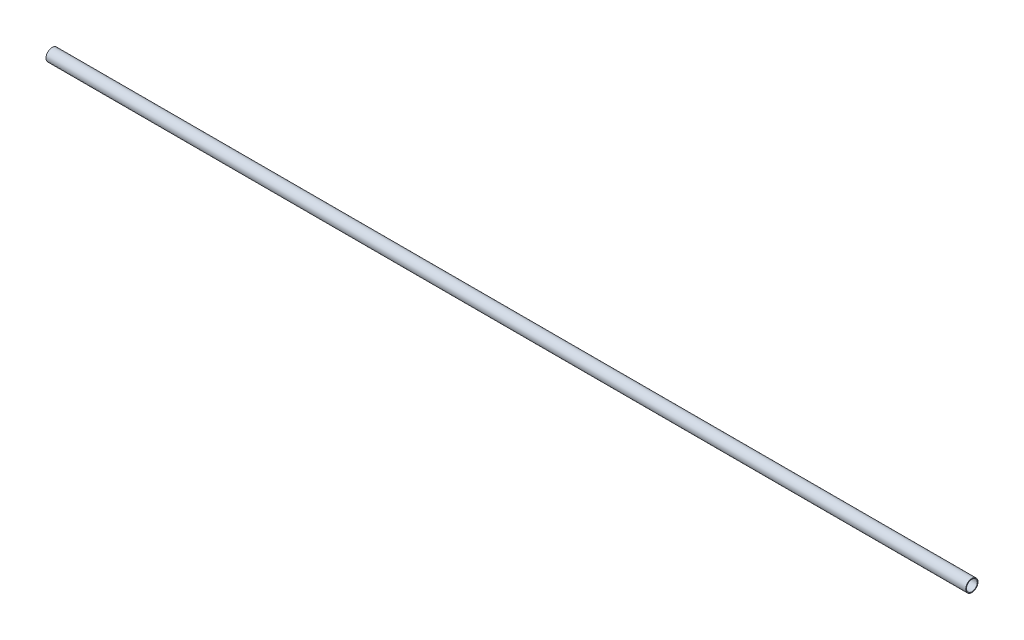
ISO-10303-21;
HEADER;
FILE_DESCRIPTION(('STEP AP214'),'2;1');
FILE_NAME('part.step','',(''),(''),'','','');
FILE_SCHEMA(('AUTOMOTIVE_DESIGN { 1 0 10303 214 1 1 1 1 }'));
ENDSEC;
DATA;
#1=APPLICATION_CONTEXT('core data for automotive mechanical design processes');
#2=APPLICATION_PROTOCOL_DEFINITION('international standard','automotive_design',2000,#1);
#3=PRODUCT_CONTEXT('',#1,'mechanical');
#4=PRODUCT('Part','Part','',(#3));
#5=PRODUCT_RELATED_PRODUCT_CATEGORY('part','',(#4));
#6=PRODUCT_DEFINITION_FORMATION('','',#4);
#7=PRODUCT_DEFINITION_CONTEXT('part definition',#1,'design');
#8=PRODUCT_DEFINITION('design','',#6,#7);
#9=PRODUCT_DEFINITION_SHAPE('','',#8);
#10=(LENGTH_UNIT() NAMED_UNIT(*) SI_UNIT(.MILLI.,.METRE.));
#11=(NAMED_UNIT(*) PLANE_ANGLE_UNIT() SI_UNIT($,.RADIAN.));
#12=(NAMED_UNIT(*) SI_UNIT($,.STERADIAN.) SOLID_ANGLE_UNIT());
#13=UNCERTAINTY_MEASURE_WITH_UNIT(LENGTH_MEASURE(1.E-05),#10,'distance_accuracy_value','');
#14=(GEOMETRIC_REPRESENTATION_CONTEXT(3) GLOBAL_UNCERTAINTY_ASSIGNED_CONTEXT((#13)) GLOBAL_UNIT_ASSIGNED_CONTEXT((#10,
#11,#12)) REPRESENTATION_CONTEXT('',''));
#15=CARTESIAN_POINT('',(0.,0.,0.));
#16=DIRECTION('',(0.,0.,1.));
#17=DIRECTION('',(1.,0.,0.));
#18=AXIS2_PLACEMENT_3D('',#15,#16,#17);
#19=CARTESIAN_POINT('',(1872.,0.,0.));
#20=DIRECTION('',(1.,0.,0.));
#21=DIRECTION('',(0.,0.,-1.));
#22=AXIS2_PLACEMENT_3D('',#19,#20,#21);
#23=PLANE('',#22);
#24=CARTESIAN_POINT('',(1872.,0.,0.));
#25=DIRECTION('',(1.,0.,0.));
#26=DIRECTION('',(0.,0.,-1.));
#27=AXIS2_PLACEMENT_3D('',#24,#25,#26);
#28=CIRCLE('',#27,12.5);
#29=CARTESIAN_POINT('',(1872.,0.,-12.5));
#30=VERTEX_POINT('',#29);
#31=EDGE_CURVE('E10',#30,#30,#28,.T.);
#32=ORIENTED_EDGE('',*,*,#31,.T.);
#33=EDGE_LOOP('',(#32));
#34=FACE_BOUND('',#33,.T.);
#35=CARTESIAN_POINT('',(1872.,0.,0.));
#36=DIRECTION('',(1.,0.,0.));
#37=DIRECTION('',(0.,0.,-1.));
#38=AXIS2_PLACEMENT_3D('',#35,#36,#37);
#39=CIRCLE('',#38,11.);
#40=CARTESIAN_POINT('',(1872.,0.,-11.));
#41=VERTEX_POINT('',#40);
#42=EDGE_CURVE('E43',#41,#41,#39,.T.);
#43=ORIENTED_EDGE('',*,*,#42,.F.);
#44=EDGE_LOOP('',(#43));
#45=FACE_BOUND('',#44,.T.);
#46=ADVANCED_FACE('F32',(#34,#45),#23,.T.);
#47=CARTESIAN_POINT('',(0.,0.,0.));
#48=DIRECTION('',(1.,0.,0.));
#49=DIRECTION('',(0.,0.,-1.));
#50=AXIS2_PLACEMENT_3D('',#47,#48,#49);
#51=PLANE('',#50);
#52=CARTESIAN_POINT('',(0.,0.,0.));
#53=DIRECTION('',(1.,0.,0.));
#54=DIRECTION('',(0.,0.,-1.));
#55=AXIS2_PLACEMENT_3D('',#52,#53,#54);
#56=CIRCLE('',#55,12.5);
#57=CARTESIAN_POINT('',(0.,0.,-12.5));
#58=VERTEX_POINT('',#57);
#59=EDGE_CURVE('E36',#58,#58,#56,.T.);
#60=ORIENTED_EDGE('',*,*,#59,.F.);
#61=EDGE_LOOP('',(#60));
#62=FACE_BOUND('',#61,.T.);
#63=CARTESIAN_POINT('',(0.,0.,0.));
#64=DIRECTION('',(1.,0.,0.));
#65=DIRECTION('',(0.,0.,-1.));
#66=AXIS2_PLACEMENT_3D('',#63,#64,#65);
#67=CIRCLE('',#66,11.);
#68=CARTESIAN_POINT('',(0.,0.,-11.));
#69=VERTEX_POINT('',#68);
#70=EDGE_CURVE('E45',#69,#69,#67,.T.);
#71=ORIENTED_EDGE('',*,*,#70,.T.);
#72=EDGE_LOOP('',(#71));
#73=FACE_BOUND('',#72,.T.);
#74=ADVANCED_FACE('F55',(#62,#73),#51,.F.);
#75=CARTESIAN_POINT('',(1872.,0.,0.));
#76=DIRECTION('',(-1.,0.,0.));
#77=DIRECTION('',(0.,0.,1.));
#78=AXIS2_PLACEMENT_3D('',#75,#76,#77);
#79=CYLINDRICAL_SURFACE('',#78,12.5);
#80=ORIENTED_EDGE('',*,*,#31,.F.);
#81=EDGE_LOOP('',(#80));
#82=FACE_BOUND('',#81,.T.);
#83=ORIENTED_EDGE('',*,*,#59,.T.);
#84=EDGE_LOOP('',(#83));
#85=FACE_BOUND('',#84,.T.);
#86=ADVANCED_FACE('F34',(#82,#85),#79,.T.);
#87=CARTESIAN_POINT('',(1872.,0.,0.));
#88=DIRECTION('',(-1.,0.,0.));
#89=DIRECTION('',(0.,0.,1.));
#90=AXIS2_PLACEMENT_3D('',#87,#88,#89);
#91=CYLINDRICAL_SURFACE('',#90,11.);
#92=ORIENTED_EDGE('',*,*,#42,.T.);
#93=EDGE_LOOP('',(#92));
#94=FACE_BOUND('',#93,.T.);
#95=ORIENTED_EDGE('',*,*,#70,.F.);
#96=EDGE_LOOP('',(#95));
#97=FACE_BOUND('',#96,.T.);
#98=ADVANCED_FACE('F51',(#94,#97),#91,.F.);
#99=CLOSED_SHELL('',(#46,#74,#86,#98));
#100=MANIFOLD_SOLID_BREP('B2',#99);
#101=ADVANCED_BREP_SHAPE_REPRESENTATION('',(#18,#100),#14);
#102=SHAPE_DEFINITION_REPRESENTATION(#9,#101);
ENDSEC;
END-ISO-10303-21;
